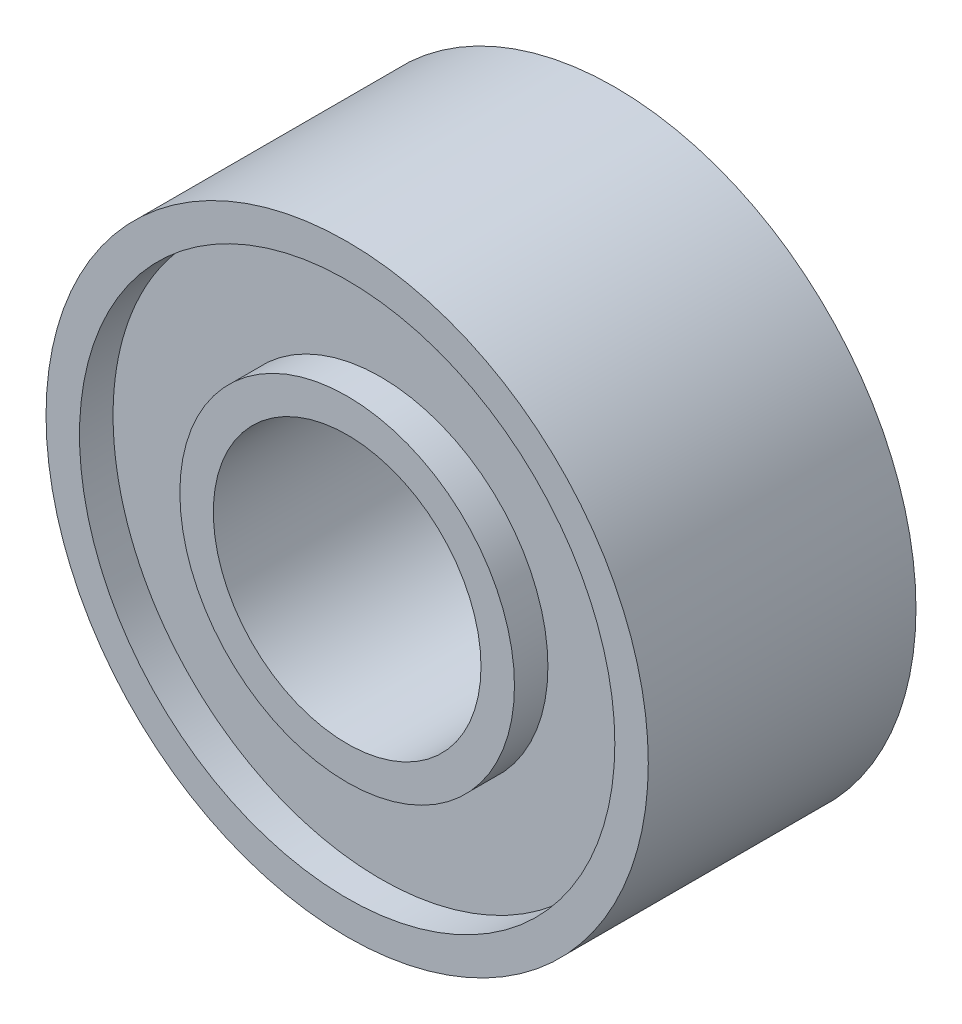
ISO-10303-21;
HEADER;
FILE_DESCRIPTION(('STEP AP214'),'2;1');
FILE_NAME('part.step','',(''),(''),'','','');
FILE_SCHEMA(('AUTOMOTIVE_DESIGN { 1 0 10303 214 1 1 1 1 }'));
ENDSEC;
DATA;
#1=APPLICATION_CONTEXT('core data for automotive mechanical design processes');
#2=APPLICATION_PROTOCOL_DEFINITION('international standard','automotive_design',2000,#1);
#3=PRODUCT_CONTEXT('',#1,'mechanical');
#4=PRODUCT('Part','Part','',(#3));
#5=PRODUCT_RELATED_PRODUCT_CATEGORY('part','',(#4));
#6=PRODUCT_DEFINITION_FORMATION('','',#4);
#7=PRODUCT_DEFINITION_CONTEXT('part definition',#1,'design');
#8=PRODUCT_DEFINITION('design','',#6,#7);
#9=PRODUCT_DEFINITION_SHAPE('','',#8);
#10=(LENGTH_UNIT() NAMED_UNIT(*) SI_UNIT(.MILLI.,.METRE.));
#11=(NAMED_UNIT(*) PLANE_ANGLE_UNIT() SI_UNIT($,.RADIAN.));
#12=(NAMED_UNIT(*) SI_UNIT($,.STERADIAN.) SOLID_ANGLE_UNIT());
#13=UNCERTAINTY_MEASURE_WITH_UNIT(LENGTH_MEASURE(1.E-05),#10,'distance_accuracy_value','');
#14=(GEOMETRIC_REPRESENTATION_CONTEXT(3) GLOBAL_UNCERTAINTY_ASSIGNED_CONTEXT((#13)) GLOBAL_UNIT_ASSIGNED_CONTEXT((#10,
#11,#12)) REPRESENTATION_CONTEXT('',''));
#15=CARTESIAN_POINT('',(0.,0.,0.));
#16=DIRECTION('',(0.,0.,1.));
#17=DIRECTION('',(1.,0.,0.));
#18=AXIS2_PLACEMENT_3D('',#15,#16,#17);
#19=CARTESIAN_POINT('',(0.,0.,4.));
#20=DIRECTION('',(0.,0.,-1.));
#21=DIRECTION('',(-1.,0.,0.));
#22=AXIS2_PLACEMENT_3D('',#19,#20,#21);
#23=CYLINDRICAL_SURFACE('',#22,2.5);
#24=CARTESIAN_POINT('',(0.,0.,0.499988));
#25=DIRECTION('',(0.,0.,-1.));
#26=DIRECTION('',(-1.,0.,0.));
#27=AXIS2_PLACEMENT_3D('',#24,#25,#26);
#28=CIRCLE('',#27,2.5);
#29=CARTESIAN_POINT('',(-2.5,0.,0.499988));
#30=VERTEX_POINT('',#29);
#31=EDGE_CURVE('E12',#30,#30,#28,.F.);
#32=ORIENTED_EDGE('',*,*,#31,.F.);
#33=EDGE_LOOP('',(#32));
#34=FACE_BOUND('',#33,.T.);
#35=CARTESIAN_POINT('',(0.,0.,3.5));
#36=DIRECTION('',(0.,0.,1.));
#37=DIRECTION('',(1.,0.,0.));
#38=AXIS2_PLACEMENT_3D('',#35,#36,#37);
#39=CIRCLE('',#38,2.5);
#40=CARTESIAN_POINT('',(2.5,0.,3.5));
#41=VERTEX_POINT('',#40);
#42=EDGE_CURVE('E66',#41,#41,#39,.F.);
#43=ORIENTED_EDGE('',*,*,#42,.F.);
#44=EDGE_LOOP('',(#43));
#45=FACE_BOUND('',#44,.T.);
#46=ADVANCED_FACE('F56',(#34,#45),#23,.F.);
#47=CARTESIAN_POINT('',(0.,0.,4.));
#48=DIRECTION('',(0.,0.,-1.));
#49=DIRECTION('',(-1.,0.,0.));
#50=AXIS2_PLACEMENT_3D('',#47,#48,#49);
#51=CYLINDRICAL_SURFACE('',#50,4.);
#52=CARTESIAN_POINT('',(0.,0.,0.499988));
#53=DIRECTION('',(0.,0.,-1.));
#54=DIRECTION('',(-1.,0.,0.));
#55=AXIS2_PLACEMENT_3D('',#52,#53,#54);
#56=CIRCLE('',#55,4.);
#57=CARTESIAN_POINT('',(-4.,0.,0.499988));
#58=VERTEX_POINT('',#57);
#59=EDGE_CURVE('E62',#58,#58,#56,.T.);
#60=ORIENTED_EDGE('',*,*,#59,.F.);
#61=EDGE_LOOP('',(#60));
#62=FACE_BOUND('',#61,.T.);
#63=CARTESIAN_POINT('',(0.,0.,3.5));
#64=DIRECTION('',(0.,0.,1.));
#65=DIRECTION('',(1.,0.,0.));
#66=AXIS2_PLACEMENT_3D('',#63,#64,#65);
#67=CIRCLE('',#66,4.);
#68=CARTESIAN_POINT('',(4.,0.,3.5));
#69=VERTEX_POINT('',#68);
#70=EDGE_CURVE('E70',#69,#69,#67,.T.);
#71=ORIENTED_EDGE('',*,*,#70,.F.);
#72=EDGE_LOOP('',(#71));
#73=FACE_BOUND('',#72,.T.);
#74=ADVANCED_FACE('F79',(#62,#73),#51,.T.);
#75=CARTESIAN_POINT('',(0.,0.,0.499988));
#76=DIRECTION('',(0.,0.,-1.));
#77=DIRECTION('',(-1.,0.,0.));
#78=AXIS2_PLACEMENT_3D('',#75,#76,#77);
#79=PLANE('',#78);
#80=ORIENTED_EDGE('',*,*,#59,.T.);
#81=EDGE_LOOP('',(#80));
#82=FACE_BOUND('',#81,.T.);
#83=ORIENTED_EDGE('',*,*,#31,.T.);
#84=EDGE_LOOP('',(#83));
#85=FACE_BOUND('',#84,.T.);
#86=ADVANCED_FACE('F81',(#82,#85),#79,.T.);
#87=CARTESIAN_POINT('',(0.,0.,3.5));
#88=DIRECTION('',(0.,0.,1.));
#89=DIRECTION('',(1.,0.,0.));
#90=AXIS2_PLACEMENT_3D('',#87,#88,#89);
#91=PLANE('',#90);
#92=ORIENTED_EDGE('',*,*,#70,.T.);
#93=EDGE_LOOP('',(#92));
#94=FACE_BOUND('',#93,.T.);
#95=ORIENTED_EDGE('',*,*,#42,.T.);
#96=EDGE_LOOP('',(#95));
#97=FACE_BOUND('',#96,.T.);
#98=ADVANCED_FACE('F76',(#94,#97),#91,.T.);
#99=CLOSED_SHELL('',(#46,#74,#86,#98));
#100=MANIFOLD_SOLID_BREP('B2',#99);
#101=CARTESIAN_POINT('',(0.,0.,4.));
#102=DIRECTION('',(0.,0.,-1.));
#103=DIRECTION('',(-1.,0.,0.));
#104=AXIS2_PLACEMENT_3D('',#101,#102,#103);
#105=CYLINDRICAL_SURFACE('',#104,2.);
#106=CARTESIAN_POINT('',(0.,0.,4.));
#107=DIRECTION('',(0.,0.,1.));
#108=DIRECTION('',(1.,0.,0.));
#109=AXIS2_PLACEMENT_3D('',#106,#107,#108);
#110=CIRCLE('',#109,2.);
#111=CARTESIAN_POINT('',(2.,0.,4.));
#112=VERTEX_POINT('',#111);
#113=EDGE_CURVE('E138',#112,#112,#110,.T.);
#114=ORIENTED_EDGE('',*,*,#113,.T.);
#115=EDGE_LOOP('',(#114));
#116=FACE_BOUND('',#115,.T.);
#117=CARTESIAN_POINT('',(0.,0.,0.));
#118=DIRECTION('',(0.,0.,1.));
#119=DIRECTION('',(1.,0.,0.));
#120=AXIS2_PLACEMENT_3D('',#117,#118,#119);
#121=CIRCLE('',#120,2.);
#122=CARTESIAN_POINT('',(2.,0.,0.));
#123=VERTEX_POINT('',#122);
#124=EDGE_CURVE('E144',#123,#123,#121,.T.);
#125=ORIENTED_EDGE('',*,*,#124,.F.);
#126=EDGE_LOOP('',(#125));
#127=FACE_BOUND('',#126,.T.);
#128=ADVANCED_FACE('F131',(#116,#127),#105,.F.);
#129=CARTESIAN_POINT('',(0.,0.,4.));
#130=DIRECTION('',(0.,0.,-1.));
#131=DIRECTION('',(-1.,0.,0.));
#132=AXIS2_PLACEMENT_3D('',#129,#130,#131);
#133=CYLINDRICAL_SURFACE('',#132,2.5);
#134=CARTESIAN_POINT('',(0.,0.,4.));
#135=DIRECTION('',(0.,0.,1.));
#136=DIRECTION('',(1.,0.,0.));
#137=AXIS2_PLACEMENT_3D('',#134,#135,#136);
#138=CIRCLE('',#137,2.5);
#139=CARTESIAN_POINT('',(2.5,0.,4.));
#140=VERTEX_POINT('',#139);
#141=EDGE_CURVE('E55',#140,#140,#138,.T.);
#142=ORIENTED_EDGE('',*,*,#141,.F.);
#143=EDGE_LOOP('',(#142));
#144=FACE_BOUND('',#143,.T.);
#145=CARTESIAN_POINT('',(0.,0.,0.));
#146=DIRECTION('',(0.,0.,1.));
#147=DIRECTION('',(1.,0.,0.));
#148=AXIS2_PLACEMENT_3D('',#145,#146,#147);
#149=CIRCLE('',#148,2.5);
#150=CARTESIAN_POINT('',(2.5,0.,0.));
#151=VERTEX_POINT('',#150);
#152=EDGE_CURVE('E134',#151,#151,#149,.T.);
#153=ORIENTED_EDGE('',*,*,#152,.T.);
#154=EDGE_LOOP('',(#153));
#155=FACE_BOUND('',#154,.T.);
#156=ADVANCED_FACE('F151',(#144,#155),#133,.T.);
#157=CARTESIAN_POINT('',(0.,0.,4.));
#158=DIRECTION('',(0.,0.,1.));
#159=DIRECTION('',(1.,0.,0.));
#160=AXIS2_PLACEMENT_3D('',#157,#158,#159);
#161=PLANE('',#160);
#162=ORIENTED_EDGE('',*,*,#113,.F.);
#163=EDGE_LOOP('',(#162));
#164=FACE_BOUND('',#163,.T.);
#165=ORIENTED_EDGE('',*,*,#141,.T.);
#166=EDGE_LOOP('',(#165));
#167=FACE_BOUND('',#166,.T.);
#168=ADVANCED_FACE('F155',(#164,#167),#161,.T.);
#169=CARTESIAN_POINT('',(0.,0.,0.));
#170=DIRECTION('',(0.,0.,1.));
#171=DIRECTION('',(1.,0.,0.));
#172=AXIS2_PLACEMENT_3D('',#169,#170,#171);
#173=PLANE('',#172);
#174=ORIENTED_EDGE('',*,*,#124,.T.);
#175=EDGE_LOOP('',(#174));
#176=FACE_BOUND('',#175,.T.);
#177=ORIENTED_EDGE('',*,*,#152,.F.);
#178=EDGE_LOOP('',(#177));
#179=FACE_BOUND('',#178,.T.);
#180=ADVANCED_FACE('F153',(#176,#179),#173,.F.);
#181=CLOSED_SHELL('',(#128,#156,#168,#180));
#182=MANIFOLD_SOLID_BREP('B7',#181);
#183=CARTESIAN_POINT('',(0.,0.,4.));
#184=DIRECTION('',(0.,0.,-1.));
#185=DIRECTION('',(-1.,0.,0.));
#186=AXIS2_PLACEMENT_3D('',#183,#184,#185);
#187=CYLINDRICAL_SURFACE('',#186,4.);
#188=CARTESIAN_POINT('',(0.,0.,4.));
#189=DIRECTION('',(0.,0.,1.));
#190=DIRECTION('',(1.,0.,0.));
#191=AXIS2_PLACEMENT_3D('',#188,#189,#190);
#192=CIRCLE('',#191,4.);
#193=CARTESIAN_POINT('',(4.,0.,4.));
#194=VERTEX_POINT('',#193);
#195=EDGE_CURVE('E202',#194,#194,#192,.T.);
#196=ORIENTED_EDGE('',*,*,#195,.T.);
#197=EDGE_LOOP('',(#196));
#198=FACE_BOUND('',#197,.T.);
#199=CARTESIAN_POINT('',(0.,0.,0.));
#200=DIRECTION('',(0.,0.,1.));
#201=DIRECTION('',(1.,0.,0.));
#202=AXIS2_PLACEMENT_3D('',#199,#200,#201);
#203=CIRCLE('',#202,4.);
#204=CARTESIAN_POINT('',(4.,0.,0.));
#205=VERTEX_POINT('',#204);
#206=EDGE_CURVE('E208',#205,#205,#203,.T.);
#207=ORIENTED_EDGE('',*,*,#206,.F.);
#208=EDGE_LOOP('',(#207));
#209=FACE_BOUND('',#208,.T.);
#210=ADVANCED_FACE('F195',(#198,#209),#187,.F.);
#211=CARTESIAN_POINT('',(0.,0.,4.));
#212=DIRECTION('',(0.,0.,-1.));
#213=DIRECTION('',(-1.,0.,0.));
#214=AXIS2_PLACEMENT_3D('',#211,#212,#213);
#215=CYLINDRICAL_SURFACE('',#214,4.5);
#216=CARTESIAN_POINT('',(0.,0.,4.));
#217=DIRECTION('',(0.,0.,1.));
#218=DIRECTION('',(1.,0.,0.));
#219=AXIS2_PLACEMENT_3D('',#216,#217,#218);
#220=CIRCLE('',#219,4.5);
#221=CARTESIAN_POINT('',(4.5,0.,4.));
#222=VERTEX_POINT('',#221);
#223=EDGE_CURVE('E130',#222,#222,#220,.T.);
#224=ORIENTED_EDGE('',*,*,#223,.F.);
#225=EDGE_LOOP('',(#224));
#226=FACE_BOUND('',#225,.T.);
#227=CARTESIAN_POINT('',(0.,0.,0.));
#228=DIRECTION('',(0.,0.,1.));
#229=DIRECTION('',(1.,0.,0.));
#230=AXIS2_PLACEMENT_3D('',#227,#228,#229);
#231=CIRCLE('',#230,4.5);
#232=CARTESIAN_POINT('',(4.5,0.,0.));
#233=VERTEX_POINT('',#232);
#234=EDGE_CURVE('E198',#233,#233,#231,.T.);
#235=ORIENTED_EDGE('',*,*,#234,.T.);
#236=EDGE_LOOP('',(#235));
#237=FACE_BOUND('',#236,.T.);
#238=ADVANCED_FACE('F215',(#226,#237),#215,.T.);
#239=CARTESIAN_POINT('',(0.,0.,4.));
#240=DIRECTION('',(0.,0.,1.));
#241=DIRECTION('',(1.,0.,0.));
#242=AXIS2_PLACEMENT_3D('',#239,#240,#241);
#243=PLANE('',#242);
#244=ORIENTED_EDGE('',*,*,#195,.F.);
#245=EDGE_LOOP('',(#244));
#246=FACE_BOUND('',#245,.T.);
#247=ORIENTED_EDGE('',*,*,#223,.T.);
#248=EDGE_LOOP('',(#247));
#249=FACE_BOUND('',#248,.T.);
#250=ADVANCED_FACE('F219',(#246,#249),#243,.T.);
#251=CARTESIAN_POINT('',(0.,0.,0.));
#252=DIRECTION('',(0.,0.,1.));
#253=DIRECTION('',(1.,0.,0.));
#254=AXIS2_PLACEMENT_3D('',#251,#252,#253);
#255=PLANE('',#254);
#256=ORIENTED_EDGE('',*,*,#206,.T.);
#257=EDGE_LOOP('',(#256));
#258=FACE_BOUND('',#257,.T.);
#259=ORIENTED_EDGE('',*,*,#234,.F.);
#260=EDGE_LOOP('',(#259));
#261=FACE_BOUND('',#260,.T.);
#262=ADVANCED_FACE('F217',(#258,#261),#255,.F.);
#263=CLOSED_SHELL('',(#210,#238,#250,#262));
#264=MANIFOLD_SOLID_BREP('B50',#263);
#265=ADVANCED_BREP_SHAPE_REPRESENTATION('',(#18,#100,#182,#264),#14);
#266=SHAPE_DEFINITION_REPRESENTATION(#9,#265);
ENDSEC;
END-ISO-10303-21;
